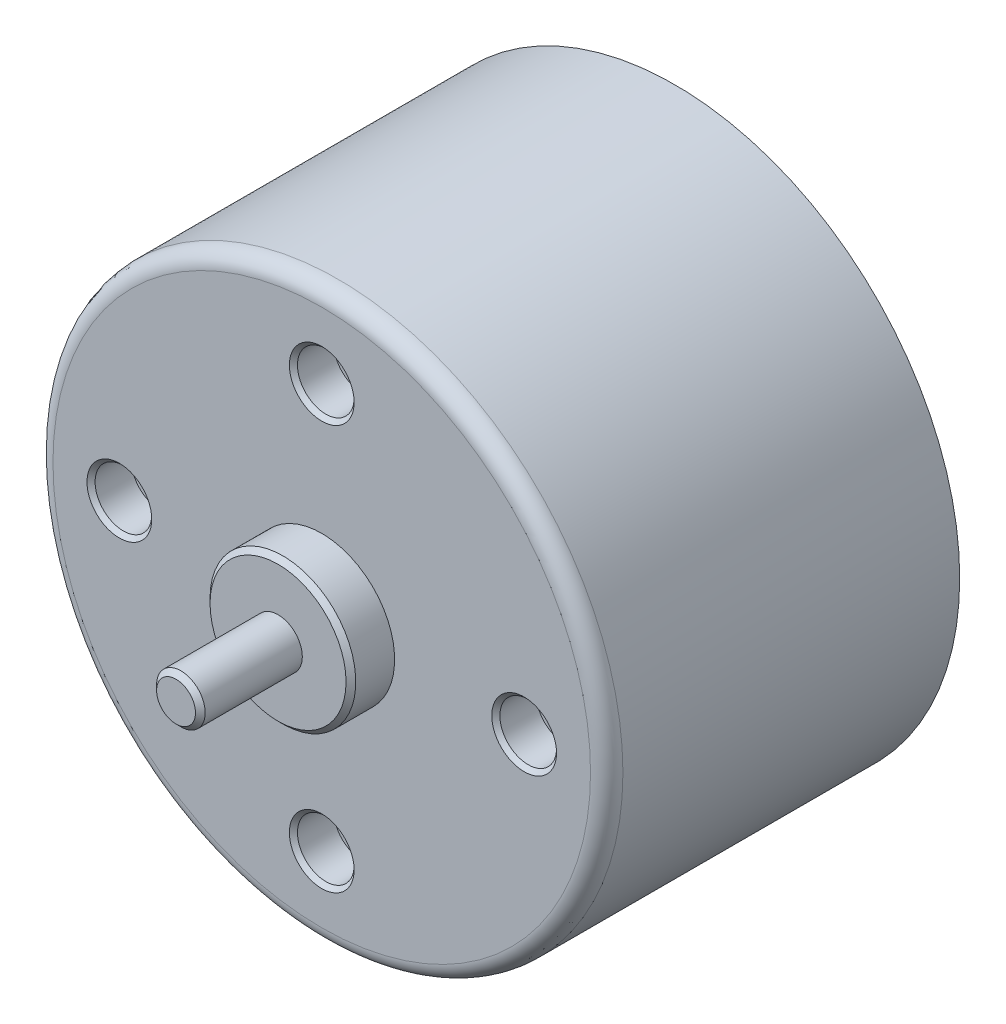
ISO-10303-21;
HEADER;
FILE_DESCRIPTION(('STEP AP214'),'2;1');
FILE_NAME('part.step','',(''),(''),'','','');
FILE_SCHEMA(('AUTOMOTIVE_DESIGN { 1 0 10303 214 1 1 1 1 }'));
ENDSEC;
DATA;
#1=APPLICATION_CONTEXT('core data for automotive mechanical design processes');
#2=APPLICATION_PROTOCOL_DEFINITION('international standard','automotive_design',2000,#1);
#3=PRODUCT_CONTEXT('',#1,'mechanical');
#4=PRODUCT('Part','Part','',(#3));
#5=PRODUCT_RELATED_PRODUCT_CATEGORY('part','',(#4));
#6=PRODUCT_DEFINITION_FORMATION('','',#4);
#7=PRODUCT_DEFINITION_CONTEXT('part definition',#1,'design');
#8=PRODUCT_DEFINITION('design','',#6,#7);
#9=PRODUCT_DEFINITION_SHAPE('','',#8);
#10=(LENGTH_UNIT() NAMED_UNIT(*) SI_UNIT(.MILLI.,.METRE.));
#11=(NAMED_UNIT(*) PLANE_ANGLE_UNIT() SI_UNIT($,.RADIAN.));
#12=(NAMED_UNIT(*) SI_UNIT($,.STERADIAN.) SOLID_ANGLE_UNIT());
#13=UNCERTAINTY_MEASURE_WITH_UNIT(LENGTH_MEASURE(1.E-05),#10,'distance_accuracy_value','');
#14=(GEOMETRIC_REPRESENTATION_CONTEXT(3) GLOBAL_UNCERTAINTY_ASSIGNED_CONTEXT((#13)) GLOBAL_UNIT_ASSIGNED_CONTEXT((#10,
#11,#12)) REPRESENTATION_CONTEXT('',''));
#15=CARTESIAN_POINT('',(0.,0.,0.));
#16=DIRECTION('',(0.,0.,1.));
#17=DIRECTION('',(1.,0.,0.));
#18=AXIS2_PLACEMENT_3D('',#15,#16,#17);
#19=CARTESIAN_POINT('',(0.,0.,21.8));
#20=DIRECTION('',(0.,0.,-1.));
#21=DIRECTION('',(-1.,0.,0.));
#22=AXIS2_PLACEMENT_3D('',#19,#20,#21);
#23=CYLINDRICAL_SURFACE('',#22,17.6);
#24=CARTESIAN_POINT('',(0.,0.,20.8));
#25=DIRECTION('',(0.,0.,1.));
#26=DIRECTION('',(1.,0.,0.));
#27=AXIS2_PLACEMENT_3D('',#24,#25,#26);
#28=CIRCLE('',#27,17.6);
#29=CARTESIAN_POINT('',(17.6,0.,20.8));
#30=VERTEX_POINT('',#29);
#31=EDGE_CURVE('E51',#30,#30,#28,.F.);
#32=ORIENTED_EDGE('',*,*,#31,.T.);
#33=EDGE_LOOP('',(#32));
#34=FACE_BOUND('',#33,.T.);
#35=CARTESIAN_POINT('',(0.,0.,0.));
#36=DIRECTION('',(0.,0.,1.));
#37=DIRECTION('',(1.,0.,0.));
#38=AXIS2_PLACEMENT_3D('',#35,#36,#37);
#39=CIRCLE('',#38,17.6);
#40=CARTESIAN_POINT('',(17.6,0.,0.));
#41=VERTEX_POINT('',#40);
#42=EDGE_CURVE('E94',#41,#41,#39,.T.);
#43=ORIENTED_EDGE('',*,*,#42,.T.);
#44=EDGE_LOOP('',(#43));
#45=FACE_BOUND('',#44,.T.);
#46=ADVANCED_FACE('F31',(#34,#45),#23,.T.);
#47=CARTESIAN_POINT('',(0.,0.,21.8));
#48=DIRECTION('',(0.,0.,1.));
#49=DIRECTION('',(1.,0.,0.));
#50=AXIS2_PLACEMENT_3D('',#47,#48,#49);
#51=PLANE('',#50);
#52=CARTESIAN_POINT('',(0.,0.,21.8));
#53=DIRECTION('',(0.,0.,1.));
#54=DIRECTION('',(1.,0.,0.));
#55=AXIS2_PLACEMENT_3D('',#52,#53,#54);
#56=CIRCLE('',#55,16.6);
#57=CARTESIAN_POINT('',(16.6,0.,21.8));
#58=VERTEX_POINT('',#57);
#59=EDGE_CURVE('E54',#58,#58,#56,.T.);
#60=ORIENTED_EDGE('',*,*,#59,.T.);
#61=EDGE_LOOP('',(#60));
#62=FACE_BOUND('',#61,.T.);
#63=CARTESIAN_POINT('',(0.,-12.5,21.8));
#64=DIRECTION('',(0.,0.,1.));
#65=DIRECTION('',(1.,0.,0.));
#66=AXIS2_PLACEMENT_3D('',#63,#64,#65);
#67=CIRCLE('',#66,2.00000000000002);
#68=CARTESIAN_POINT('',(2.00000000000002,-12.5,21.8));
#69=VERTEX_POINT('',#68);
#70=EDGE_CURVE('E78',#69,#69,#67,.F.);
#71=ORIENTED_EDGE('',*,*,#70,.T.);
#72=EDGE_LOOP('',(#71));
#73=FACE_BOUND('',#72,.T.);
#74=CARTESIAN_POINT('',(12.5,0.,21.8));
#75=DIRECTION('',(0.,0.,1.));
#76=DIRECTION('',(1.,0.,0.));
#77=AXIS2_PLACEMENT_3D('',#74,#75,#76);
#78=CIRCLE('',#77,1.99999999999999);
#79=CARTESIAN_POINT('',(14.5,0.,21.8));
#80=VERTEX_POINT('',#79);
#81=EDGE_CURVE('E81',#80,#80,#78,.F.);
#82=ORIENTED_EDGE('',*,*,#81,.T.);
#83=EDGE_LOOP('',(#82));
#84=FACE_BOUND('',#83,.T.);
#85=CARTESIAN_POINT('',(-12.5,0.,21.8));
#86=DIRECTION('',(0.,0.,1.));
#87=DIRECTION('',(1.,0.,0.));
#88=AXIS2_PLACEMENT_3D('',#85,#86,#87);
#89=CIRCLE('',#88,1.99999999999999);
#90=CARTESIAN_POINT('',(-10.5,0.,21.8));
#91=VERTEX_POINT('',#90);
#92=EDGE_CURVE('E84',#91,#91,#89,.F.);
#93=ORIENTED_EDGE('',*,*,#92,.T.);
#94=EDGE_LOOP('',(#93));
#95=FACE_BOUND('',#94,.T.);
#96=CARTESIAN_POINT('',(0.,12.5,21.8));
#97=DIRECTION('',(0.,0.,1.));
#98=DIRECTION('',(1.,0.,0.));
#99=AXIS2_PLACEMENT_3D('',#96,#97,#98);
#100=CIRCLE('',#99,2.00000000000002);
#101=CARTESIAN_POINT('',(2.00000000000002,12.5,21.8));
#102=VERTEX_POINT('',#101);
#103=EDGE_CURVE('E87',#102,#102,#100,.F.);
#104=ORIENTED_EDGE('',*,*,#103,.T.);
#105=EDGE_LOOP('',(#104));
#106=FACE_BOUND('',#105,.T.);
#107=CARTESIAN_POINT('',(0.,0.,21.8));
#108=DIRECTION('',(0.,0.,1.));
#109=DIRECTION('',(1.,0.,0.));
#110=AXIS2_PLACEMENT_3D('',#107,#108,#109);
#111=CIRCLE('',#110,4.5);
#112=CARTESIAN_POINT('',(-4.5,0.,21.8));
#113=VERTEX_POINT('',#112);
#114=EDGE_CURVE('E97',#113,#113,#111,.T.);
#115=ORIENTED_EDGE('',*,*,#114,.F.);
#116=EDGE_LOOP('',(#115));
#117=FACE_BOUND('',#116,.T.);
#118=ADVANCED_FACE('F138',(#62,#73,#84,#95,#106,#117),#51,.T.);
#119=CARTESIAN_POINT('',(0.,0.,0.));
#120=DIRECTION('',(0.,0.,1.));
#121=DIRECTION('',(1.,0.,0.));
#122=AXIS2_PLACEMENT_3D('',#119,#120,#121);
#123=PLANE('',#122);
#124=CARTESIAN_POINT('',(0.,0.,0.));
#125=DIRECTION('',(0.,0.,-1.));
#126=DIRECTION('',(-1.,0.,0.));
#127=AXIS2_PLACEMENT_3D('',#124,#125,#126);
#128=CIRCLE('',#127,4.5);
#129=CARTESIAN_POINT('',(4.5,0.,0.));
#130=VERTEX_POINT('',#129);
#131=EDGE_CURVE('E104',#130,#130,#128,.T.);
#132=ORIENTED_EDGE('',*,*,#131,.F.);
#133=EDGE_LOOP('',(#132));
#134=FACE_BOUND('',#133,.T.);
#135=ORIENTED_EDGE('',*,*,#42,.F.);
#136=EDGE_LOOP('',(#135));
#137=FACE_BOUND('',#136,.T.);
#138=ADVANCED_FACE('F144',(#134,#137),#123,.F.);
#139=CARTESIAN_POINT('',(0.,0.,24.5));
#140=DIRECTION('',(0.,0.,-1.));
#141=DIRECTION('',(-1.,0.,0.));
#142=AXIS2_PLACEMENT_3D('',#139,#140,#141);
#143=CYLINDRICAL_SURFACE('',#142,4.5);
#144=CARTESIAN_POINT('',(0.,0.,24.2));
#145=DIRECTION('',(0.,0.,1.));
#146=DIRECTION('',(1.,0.,0.));
#147=AXIS2_PLACEMENT_3D('',#144,#145,#146);
#148=CIRCLE('',#147,4.5);
#149=CARTESIAN_POINT('',(-4.5,0.,24.2));
#150=VERTEX_POINT('',#149);
#151=EDGE_CURVE('E57',#150,#150,#148,.F.);
#152=CARTESIAN_POINT('',(-4.5,0.,24.2));
#153=CARTESIAN_POINT('',(-4.5,0.,24.175));
#154=CARTESIAN_POINT('',(-4.5,0.,24.15));
#155=CARTESIAN_POINT('',(-4.5,0.,24.1));
#156=CARTESIAN_POINT('',(-4.5,0.,24.075));
#157=CARTESIAN_POINT('',(-4.5,0.,24.025));
#158=CARTESIAN_POINT('',(-4.5,0.,24.));
#159=CARTESIAN_POINT('',(-4.5,0.,23.95));
#160=CARTESIAN_POINT('',(-4.5,0.,23.925));
#161=CARTESIAN_POINT('',(-4.5,0.,23.875));
#162=CARTESIAN_POINT('',(-4.5,0.,23.85));
#163=CARTESIAN_POINT('',(-4.5,0.,23.8));
#164=CARTESIAN_POINT('',(-4.5,0.,23.775));
#165=CARTESIAN_POINT('',(-4.5,0.,23.725));
#166=CARTESIAN_POINT('',(-4.5,0.,23.7));
#167=CARTESIAN_POINT('',(-4.5,0.,23.65));
#168=CARTESIAN_POINT('',(-4.5,0.,23.625));
#169=CARTESIAN_POINT('',(-4.5,0.,23.575));
#170=CARTESIAN_POINT('',(-4.5,0.,23.55));
#171=CARTESIAN_POINT('',(-4.5,0.,23.5));
#172=CARTESIAN_POINT('',(-4.5,0.,23.475));
#173=CARTESIAN_POINT('',(-4.5,0.,23.425));
#174=CARTESIAN_POINT('',(-4.5,0.,23.4));
#175=CARTESIAN_POINT('',(-4.5,0.,23.35));
#176=CARTESIAN_POINT('',(-4.5,0.,23.325));
#177=CARTESIAN_POINT('',(-4.5,0.,23.275));
#178=CARTESIAN_POINT('',(-4.5,0.,23.25));
#179=CARTESIAN_POINT('',(-4.5,0.,23.2));
#180=CARTESIAN_POINT('',(-4.5,0.,23.175));
#181=CARTESIAN_POINT('',(-4.5,0.,23.125));
#182=CARTESIAN_POINT('',(-4.5,0.,23.1));
#183=CARTESIAN_POINT('',(-4.5,0.,23.05));
#184=CARTESIAN_POINT('',(-4.5,0.,23.025));
#185=CARTESIAN_POINT('',(-4.5,0.,22.975));
#186=CARTESIAN_POINT('',(-4.5,0.,22.95));
#187=CARTESIAN_POINT('',(-4.5,0.,22.9));
#188=CARTESIAN_POINT('',(-4.5,0.,22.875));
#189=CARTESIAN_POINT('',(-4.5,0.,22.825));
#190=CARTESIAN_POINT('',(-4.5,0.,22.8));
#191=CARTESIAN_POINT('',(-4.5,0.,22.75));
#192=CARTESIAN_POINT('',(-4.5,0.,22.725));
#193=CARTESIAN_POINT('',(-4.5,0.,22.675));
#194=CARTESIAN_POINT('',(-4.5,0.,22.65));
#195=CARTESIAN_POINT('',(-4.5,0.,22.6));
#196=CARTESIAN_POINT('',(-4.5,0.,22.575));
#197=CARTESIAN_POINT('',(-4.5,0.,22.525));
#198=CARTESIAN_POINT('',(-4.5,0.,22.5));
#199=CARTESIAN_POINT('',(-4.5,0.,22.45));
#200=CARTESIAN_POINT('',(-4.5,0.,22.425));
#201=CARTESIAN_POINT('',(-4.5,0.,22.375));
#202=CARTESIAN_POINT('',(-4.5,0.,22.35));
#203=CARTESIAN_POINT('',(-4.5,0.,22.3));
#204=CARTESIAN_POINT('',(-4.5,0.,22.275));
#205=CARTESIAN_POINT('',(-4.5,0.,22.225));
#206=CARTESIAN_POINT('',(-4.5,0.,22.2));
#207=CARTESIAN_POINT('',(-4.5,0.,22.15));
#208=CARTESIAN_POINT('',(-4.5,0.,22.125));
#209=CARTESIAN_POINT('',(-4.5,0.,22.075));
#210=CARTESIAN_POINT('',(-4.5,0.,22.05));
#211=CARTESIAN_POINT('',(-4.5,0.,22.));
#212=CARTESIAN_POINT('',(-4.5,0.,21.975));
#213=CARTESIAN_POINT('',(-4.5,0.,21.925));
#214=CARTESIAN_POINT('',(-4.5,0.,21.9));
#215=CARTESIAN_POINT('',(-4.5,0.,21.85));
#216=CARTESIAN_POINT('',(-4.5,0.,21.825));
#217=CARTESIAN_POINT('',(-4.5,0.,21.8));
#218=B_SPLINE_CURVE_WITH_KNOTS('',3,(#152,#153,#154,#155,#156,#157,#158,#159,#160,#161,#162,
#163,#164,#165,#166,#167,#168,#169,#170,#171,#172,#173,#174,#175,#176,#177,#178,#179,#180,#181,
#182,#183,#184,#185,#186,#187,#188,#189,#190,#191,#192,#193,#194,#195,#196,#197,#198,#199,#200,
#201,#202,#203,#204,#205,#206,#207,#208,#209,#210,#211,#212,#213,#214,#215,#216,#217),
.UNSPECIFIED.,.F.,.F.,(4,2,2,2,2,2,2,2,2,2,2,2,2,2,2,2,2,2,2,2,2,2,2,2,2,2,2,2,2,2,2,2,4),(0.,
0.0749999999999987,0.150000000000001,0.225,0.300000000000002,0.375,0.450000000000003,
0.525000000000001,0.600000000000003,0.675000000000002,0.750000000000004,0.825000000000003,
0.900000000000005,0.975000000000004,1.05000000000001,1.125,1.20000000000001,1.27500000000001,
1.35000000000001,1.42500000000001,1.50000000000001,1.57500000000001,1.65000000000001,
1.72500000000001,1.80000000000001,1.87500000000001,1.95000000000001,2.02500000000001,
2.10000000000001,2.17500000000001,2.25000000000001,2.32500000000001,2.40000000000001),.UNSPECIFIED.);
#219=EDGE_CURVE('BSEAM206',#150,#113,#218,.T.);
#220=ORIENTED_EDGE('',*,*,#151,.T.);
#221=ORIENTED_EDGE('',*,*,#114,.T.);
#222=ORIENTED_EDGE('',*,*,#219,.T.);
#223=ORIENTED_EDGE('',*,*,#219,.F.);
#224=EDGE_LOOP('',(#220,#222,#221,#223));
#225=FACE_BOUND('',#224,.T.);
#226=ADVANCED_FACE('F206',(#225),#143,.T.);
#227=CARTESIAN_POINT('',(0.,0.,24.5));
#228=DIRECTION('',(0.,0.,1.));
#229=DIRECTION('',(1.,0.,0.));
#230=AXIS2_PLACEMENT_3D('',#227,#228,#229);
#231=PLANE('',#230);
#232=CARTESIAN_POINT('',(0.,0.,24.5));
#233=DIRECTION('',(0.,0.,1.));
#234=DIRECTION('',(1.,0.,0.));
#235=AXIS2_PLACEMENT_3D('',#232,#233,#234);
#236=CIRCLE('',#235,4.20000000000002);
#237=CARTESIAN_POINT('',(4.20000000000002,0.,24.5));
#238=VERTEX_POINT('',#237);
#239=EDGE_CURVE('E60',#238,#238,#236,.T.);
#240=ORIENTED_EDGE('',*,*,#239,.T.);
#241=EDGE_LOOP('',(#240));
#242=FACE_BOUND('',#241,.T.);
#243=CARTESIAN_POINT('',(0.,0.,24.5));
#244=DIRECTION('',(0.,0.,1.));
#245=DIRECTION('',(1.,0.,0.));
#246=AXIS2_PLACEMENT_3D('',#243,#244,#245);
#247=CIRCLE('',#246,1.5);
#248=CARTESIAN_POINT('',(1.5,0.,24.5));
#249=VERTEX_POINT('',#248);
#250=EDGE_CURVE('E101',#249,#249,#247,.T.);
#251=ORIENTED_EDGE('',*,*,#250,.F.);
#252=EDGE_LOOP('',(#251));
#253=FACE_BOUND('',#252,.T.);
#254=ADVANCED_FACE('F199',(#242,#253),#231,.T.);
#255=CARTESIAN_POINT('',(0.,0.,30.8));
#256=DIRECTION('',(0.,0.,-1.));
#257=DIRECTION('',(-1.,0.,0.));
#258=AXIS2_PLACEMENT_3D('',#255,#256,#257);
#259=CYLINDRICAL_SURFACE('',#258,1.5);
#260=CARTESIAN_POINT('',(0.,0.,30.5));
#261=DIRECTION('',(0.,0.,1.));
#262=DIRECTION('',(1.,0.,0.));
#263=AXIS2_PLACEMENT_3D('',#260,#261,#262);
#264=CIRCLE('',#263,1.5);
#265=CARTESIAN_POINT('',(1.5,0.,30.5));
#266=VERTEX_POINT('',#265);
#267=EDGE_CURVE('E42',#266,#266,#264,.F.);
#268=ORIENTED_EDGE('',*,*,#267,.T.);
#269=EDGE_LOOP('',(#268));
#270=FACE_BOUND('',#269,.T.);
#271=ORIENTED_EDGE('',*,*,#250,.T.);
#272=EDGE_LOOP('',(#271));
#273=FACE_BOUND('',#272,.T.);
#274=ADVANCED_FACE('F190',(#270,#273),#259,.T.);
#275=CARTESIAN_POINT('',(0.,0.,30.8));
#276=DIRECTION('',(0.,0.,1.));
#277=DIRECTION('',(1.,0.,0.));
#278=AXIS2_PLACEMENT_3D('',#275,#276,#277);
#279=PLANE('',#278);
#280=CARTESIAN_POINT('',(0.,0.,30.8));
#281=DIRECTION('',(0.,0.,1.));
#282=DIRECTION('',(1.,0.,0.));
#283=AXIS2_PLACEMENT_3D('',#280,#281,#282);
#284=CIRCLE('',#283,1.20000000000001);
#285=CARTESIAN_POINT('',(1.20000000000001,0.,30.8));
#286=VERTEX_POINT('',#285);
#287=EDGE_CURVE('E46',#286,#286,#284,.T.);
#288=ORIENTED_EDGE('',*,*,#287,.T.);
#289=EDGE_LOOP('',(#288));
#290=FACE_BOUND('',#289,.T.);
#291=ADVANCED_FACE('F187',(#290),#279,.T.);
#292=CARTESIAN_POINT('',(0.,0.,-2.7));
#293=DIRECTION('',(0.,0.,1.));
#294=DIRECTION('',(1.,0.,0.));
#295=AXIS2_PLACEMENT_3D('',#292,#293,#294);
#296=CYLINDRICAL_SURFACE('',#295,4.5);
#297=CARTESIAN_POINT('',(0.,0.,-2.40000000000001));
#298=DIRECTION('',(0.,0.,-1.));
#299=DIRECTION('',(-1.,0.,0.));
#300=AXIS2_PLACEMENT_3D('',#297,#298,#299);
#301=CIRCLE('',#300,4.5);
#302=CARTESIAN_POINT('',(4.5,0.,-2.40000000000001));
#303=VERTEX_POINT('',#302);
#304=EDGE_CURVE('E63',#303,#303,#301,.F.);
#305=CARTESIAN_POINT('',(4.5,0.,-2.40000000000001));
#306=CARTESIAN_POINT('',(4.5,0.,-2.37500000000001));
#307=CARTESIAN_POINT('',(4.5,0.,-2.35000000000001));
#308=CARTESIAN_POINT('',(4.5,0.,-2.30000000000001));
#309=CARTESIAN_POINT('',(4.5,0.,-2.27500000000001));
#310=CARTESIAN_POINT('',(4.5,0.,-2.22500000000001));
#311=CARTESIAN_POINT('',(4.5,0.,-2.20000000000001));
#312=CARTESIAN_POINT('',(4.5,0.,-2.15000000000001));
#313=CARTESIAN_POINT('',(4.5,0.,-2.12500000000001));
#314=CARTESIAN_POINT('',(4.5,0.,-2.07500000000001));
#315=CARTESIAN_POINT('',(4.5,0.,-2.05000000000001));
#316=CARTESIAN_POINT('',(4.5,0.,-2.00000000000001));
#317=CARTESIAN_POINT('',(4.5,0.,-1.97500000000001));
#318=CARTESIAN_POINT('',(4.5,0.,-1.92500000000001));
#319=CARTESIAN_POINT('',(4.5,0.,-1.90000000000001));
#320=CARTESIAN_POINT('',(4.5,0.,-1.85000000000001));
#321=CARTESIAN_POINT('',(4.5,0.,-1.82500000000001));
#322=CARTESIAN_POINT('',(4.5,0.,-1.77500000000001));
#323=CARTESIAN_POINT('',(4.5,0.,-1.75000000000001));
#324=CARTESIAN_POINT('',(4.5,0.,-1.70000000000001));
#325=CARTESIAN_POINT('',(4.5,0.,-1.67500000000001));
#326=CARTESIAN_POINT('',(4.5,0.,-1.62500000000001));
#327=CARTESIAN_POINT('',(4.5,0.,-1.60000000000001));
#328=CARTESIAN_POINT('',(4.5,0.,-1.55000000000001));
#329=CARTESIAN_POINT('',(4.5,0.,-1.52500000000001));
#330=CARTESIAN_POINT('',(4.5,0.,-1.47500000000001));
#331=CARTESIAN_POINT('',(4.5,0.,-1.45000000000001));
#332=CARTESIAN_POINT('',(4.5,0.,-1.40000000000001));
#333=CARTESIAN_POINT('',(4.5,0.,-1.37500000000001));
#334=CARTESIAN_POINT('',(4.5,0.,-1.32500000000001));
#335=CARTESIAN_POINT('',(4.5,0.,-1.30000000000001));
#336=CARTESIAN_POINT('',(4.5,0.,-1.25000000000001));
#337=CARTESIAN_POINT('',(4.5,0.,-1.22500000000001));
#338=CARTESIAN_POINT('',(4.5,0.,-1.17500000000001));
#339=CARTESIAN_POINT('',(4.5,0.,-1.15000000000001));
#340=CARTESIAN_POINT('',(4.5,0.,-1.10000000000001));
#341=CARTESIAN_POINT('',(4.5,0.,-1.07500000000001));
#342=CARTESIAN_POINT('',(4.5,0.,-1.02500000000001));
#343=CARTESIAN_POINT('',(4.5,0.,-1.00000000000001));
#344=CARTESIAN_POINT('',(4.5,0.,-0.950000000000005));
#345=CARTESIAN_POINT('',(4.5,0.,-0.925000000000005));
#346=CARTESIAN_POINT('',(4.5,0.,-0.875000000000005));
#347=CARTESIAN_POINT('',(4.5,0.,-0.850000000000005));
#348=CARTESIAN_POINT('',(4.5,0.,-0.800000000000004));
#349=CARTESIAN_POINT('',(4.5,0.,-0.775000000000004));
#350=CARTESIAN_POINT('',(4.5,0.,-0.725000000000004));
#351=CARTESIAN_POINT('',(4.5,0.,-0.700000000000004));
#352=CARTESIAN_POINT('',(4.5,0.,-0.650000000000003));
#353=CARTESIAN_POINT('',(4.5,0.,-0.625000000000003));
#354=CARTESIAN_POINT('',(4.5,0.,-0.575000000000003));
#355=CARTESIAN_POINT('',(4.5,0.,-0.550000000000003));
#356=CARTESIAN_POINT('',(4.5,0.,-0.500000000000002));
#357=CARTESIAN_POINT('',(4.5,0.,-0.475000000000002));
#358=CARTESIAN_POINT('',(4.5,0.,-0.425000000000002));
#359=CARTESIAN_POINT('',(4.5,0.,-0.400000000000002));
#360=CARTESIAN_POINT('',(4.5,0.,-0.350000000000002));
#361=CARTESIAN_POINT('',(4.5,0.,-0.325000000000001));
#362=CARTESIAN_POINT('',(4.5,0.,-0.275000000000001));
#363=CARTESIAN_POINT('',(4.5,0.,-0.250000000000001));
#364=CARTESIAN_POINT('',(4.5,0.,-0.200000000000001));
#365=CARTESIAN_POINT('',(4.5,0.,-0.175000000000001));
#366=CARTESIAN_POINT('',(4.5,0.,-0.125));
#367=CARTESIAN_POINT('',(4.5,0.,-0.1));
#368=CARTESIAN_POINT('',(4.5,0.,-0.0499999999999999));
#369=CARTESIAN_POINT('',(4.5,0.,-0.0249999999999997));
#370=CARTESIAN_POINT('',(4.5,0.,0.));
#371=B_SPLINE_CURVE_WITH_KNOTS('',3,(#305,#306,#307,#308,#309,#310,#311,#312,#313,#314,#315,
#316,#317,#318,#319,#320,#321,#322,#323,#324,#325,#326,#327,#328,#329,#330,#331,#332,#333,#334,
#335,#336,#337,#338,#339,#340,#341,#342,#343,#344,#345,#346,#347,#348,#349,#350,#351,#352,#353,
#354,#355,#356,#357,#358,#359,#360,#361,#362,#363,#364,#365,#366,#367,#368,#369,#370),
.UNSPECIFIED.,.F.,.F.,(4,2,2,2,2,2,2,2,2,2,2,2,2,2,2,2,2,2,2,2,2,2,2,2,2,2,2,2,2,2,2,2,4),(0.,
0.0750000000000004,0.150000000000001,0.225000000000001,0.300000000000002,0.375000000000002,
0.450000000000003,0.525000000000003,0.600000000000003,0.675000000000004,0.750000000000004,
0.825000000000004,0.900000000000005,0.975000000000005,1.05000000000001,1.12500000000001,
1.20000000000001,1.27500000000001,1.35000000000001,1.42500000000001,1.50000000000001,
1.57500000000001,1.65000000000001,1.72500000000001,1.80000000000001,1.87500000000001,
1.95000000000001,2.02500000000001,2.10000000000001,2.17500000000001,2.25000000000001,
2.32500000000001,2.40000000000001),.UNSPECIFIED.);
#372=EDGE_CURVE('BSEAM189',#303,#130,#371,.T.);
#373=ORIENTED_EDGE('',*,*,#304,.T.);
#374=ORIENTED_EDGE('',*,*,#131,.T.);
#375=ORIENTED_EDGE('',*,*,#372,.T.);
#376=ORIENTED_EDGE('',*,*,#372,.F.);
#377=EDGE_LOOP('',(#373,#375,#374,#376));
#378=FACE_BOUND('',#377,.T.);
#379=ADVANCED_FACE('F189',(#378),#296,.T.);
#380=CARTESIAN_POINT('',(0.,0.,-2.7));
#381=DIRECTION('',(0.,0.,-1.));
#382=DIRECTION('',(-1.,0.,0.));
#383=AXIS2_PLACEMENT_3D('',#380,#381,#382);
#384=PLANE('',#383);
#385=CARTESIAN_POINT('',(0.,0.,-2.7));
#386=DIRECTION('',(0.,0.,-1.));
#387=DIRECTION('',(-1.,0.,0.));
#388=AXIS2_PLACEMENT_3D('',#385,#386,#387);
#389=CIRCLE('',#388,4.20000000000002);
#390=CARTESIAN_POINT('',(-4.20000000000002,0.,-2.7));
#391=VERTEX_POINT('',#390);
#392=EDGE_CURVE('E66',#391,#391,#389,.T.);
#393=ORIENTED_EDGE('',*,*,#392,.T.);
#394=EDGE_LOOP('',(#393));
#395=FACE_BOUND('',#394,.T.);
#396=CARTESIAN_POINT('',(0.,0.,-2.7));
#397=DIRECTION('',(0.,0.,-1.));
#398=DIRECTION('',(-1.,0.,0.));
#399=AXIS2_PLACEMENT_3D('',#396,#397,#398);
#400=CIRCLE('',#399,1.5);
#401=CARTESIAN_POINT('',(-1.5,0.,-2.7));
#402=VERTEX_POINT('',#401);
#403=EDGE_CURVE('E93',#402,#402,#400,.T.);
#404=ORIENTED_EDGE('',*,*,#403,.F.);
#405=EDGE_LOOP('',(#404));
#406=FACE_BOUND('',#405,.T.);
#407=ADVANCED_FACE('F196',(#395,#406),#384,.T.);
#408=CARTESIAN_POINT('',(0.,0.,-5.2));
#409=DIRECTION('',(0.,0.,1.));
#410=DIRECTION('',(1.,0.,0.));
#411=AXIS2_PLACEMENT_3D('',#408,#409,#410);
#412=CYLINDRICAL_SURFACE('',#411,1.5);
#413=CARTESIAN_POINT('',(0.,0.,-4.90000000000002));
#414=DIRECTION('',(0.,0.,-1.));
#415=DIRECTION('',(-1.,0.,0.));
#416=AXIS2_PLACEMENT_3D('',#413,#414,#415);
#417=CIRCLE('',#416,1.5);
#418=CARTESIAN_POINT('',(-1.5,0.,-4.90000000000002));
#419=VERTEX_POINT('',#418);
#420=EDGE_CURVE('E10',#419,#419,#417,.F.);
#421=ORIENTED_EDGE('',*,*,#420,.T.);
#422=EDGE_LOOP('',(#421));
#423=FACE_BOUND('',#422,.T.);
#424=ORIENTED_EDGE('',*,*,#403,.T.);
#425=EDGE_LOOP('',(#424));
#426=FACE_BOUND('',#425,.T.);
#427=ADVANCED_FACE('F262',(#423,#426),#412,.T.);
#428=CARTESIAN_POINT('',(0.,0.,-5.2));
#429=DIRECTION('',(0.,0.,-1.));
#430=DIRECTION('',(-1.,0.,0.));
#431=AXIS2_PLACEMENT_3D('',#428,#429,#430);
#432=PLANE('',#431);
#433=CARTESIAN_POINT('',(0.,0.,-5.2));
#434=DIRECTION('',(0.,0.,-1.));
#435=DIRECTION('',(-1.,0.,0.));
#436=AXIS2_PLACEMENT_3D('',#433,#434,#435);
#437=CIRCLE('',#436,1.20000000000001);
#438=CARTESIAN_POINT('',(-1.20000000000001,0.,-5.2));
#439=VERTEX_POINT('',#438);
#440=EDGE_CURVE('E38',#439,#439,#437,.T.);
#441=ORIENTED_EDGE('',*,*,#440,.T.);
#442=EDGE_LOOP('',(#441));
#443=FACE_BOUND('',#442,.T.);
#444=ADVANCED_FACE('F267',(#443),#432,.T.);
#445=CARTESIAN_POINT('',(-12.5,0.,19.3));
#446=DIRECTION('',(0.,0.,1.));
#447=DIRECTION('',(1.,0.,0.));
#448=AXIS2_PLACEMENT_3D('',#445,#446,#447);
#449=CYLINDRICAL_SURFACE('',#448,1.75);
#450=CARTESIAN_POINT('',(-12.5,0.,21.55));
#451=DIRECTION('',(0.,0.,1.));
#452=DIRECTION('',(1.,0.,0.));
#453=AXIS2_PLACEMENT_3D('',#450,#451,#452);
#454=CIRCLE('',#453,1.75);
#455=CARTESIAN_POINT('',(-10.75,0.,21.55));
#456=VERTEX_POINT('',#455);
#457=EDGE_CURVE('E72',#456,#456,#454,.T.);
#458=ORIENTED_EDGE('',*,*,#457,.T.);
#459=EDGE_LOOP('',(#458));
#460=FACE_BOUND('',#459,.T.);
#461=CARTESIAN_POINT('',(-12.5,0.,19.3));
#462=DIRECTION('',(0.,0.,1.));
#463=DIRECTION('',(1.,0.,0.));
#464=AXIS2_PLACEMENT_3D('',#461,#462,#463);
#465=CIRCLE('',#464,1.75);
#466=CARTESIAN_POINT('',(-10.75,0.,19.3));
#467=VERTEX_POINT('',#466);
#468=EDGE_CURVE('E109',#467,#467,#465,.T.);
#469=ORIENTED_EDGE('',*,*,#468,.F.);
#470=EDGE_LOOP('',(#469));
#471=FACE_BOUND('',#470,.T.);
#472=ADVANCED_FACE('F277',(#460,#471),#449,.F.);
#473=CARTESIAN_POINT('',(-12.5,0.,19.3));
#474=DIRECTION('',(0.,0.,1.));
#475=DIRECTION('',(1.,0.,0.));
#476=AXIS2_PLACEMENT_3D('',#473,#474,#475);
#477=PLANE('',#476);
#478=ORIENTED_EDGE('',*,*,#468,.T.);
#479=EDGE_LOOP('',(#478));
#480=FACE_BOUND('',#479,.T.);
#481=ADVANCED_FACE('F296',(#480),#477,.T.);
#482=CARTESIAN_POINT('',(0.,-12.5,19.3));
#483=DIRECTION('',(0.,0.,1.));
#484=DIRECTION('',(1.,0.,0.));
#485=AXIS2_PLACEMENT_3D('',#482,#483,#484);
#486=CYLINDRICAL_SURFACE('',#485,1.75);
#487=CARTESIAN_POINT('',(0.,-12.5,21.55));
#488=DIRECTION('',(0.,0.,1.));
#489=DIRECTION('',(1.,0.,0.));
#490=AXIS2_PLACEMENT_3D('',#487,#488,#489);
#491=CIRCLE('',#490,1.75);
#492=CARTESIAN_POINT('',(1.75,-12.5,21.55));
#493=VERTEX_POINT('',#492);
#494=EDGE_CURVE('E90',#493,#493,#491,.T.);
#495=ORIENTED_EDGE('',*,*,#494,.T.);
#496=EDGE_LOOP('',(#495));
#497=FACE_BOUND('',#496,.T.);
#498=CARTESIAN_POINT('',(0.,-12.5,19.3));
#499=DIRECTION('',(0.,0.,1.));
#500=DIRECTION('',(1.,0.,0.));
#501=AXIS2_PLACEMENT_3D('',#498,#499,#500);
#502=CIRCLE('',#501,1.75);
#503=CARTESIAN_POINT('',(1.75,-12.5,19.3));
#504=VERTEX_POINT('',#503);
#505=EDGE_CURVE('E112',#504,#504,#502,.T.);
#506=ORIENTED_EDGE('',*,*,#505,.F.);
#507=EDGE_LOOP('',(#506));
#508=FACE_BOUND('',#507,.T.);
#509=ADVANCED_FACE('F304',(#497,#508),#486,.F.);
#510=CARTESIAN_POINT('',(0.,-12.5,19.3));
#511=DIRECTION('',(0.,0.,1.));
#512=DIRECTION('',(1.,0.,0.));
#513=AXIS2_PLACEMENT_3D('',#510,#511,#512);
#514=PLANE('',#513);
#515=ORIENTED_EDGE('',*,*,#505,.T.);
#516=EDGE_LOOP('',(#515));
#517=FACE_BOUND('',#516,.T.);
#518=ADVANCED_FACE('F312',(#517),#514,.T.);
#519=CARTESIAN_POINT('',(12.5,0.,19.3));
#520=DIRECTION('',(0.,0.,1.));
#521=DIRECTION('',(1.,0.,0.));
#522=AXIS2_PLACEMENT_3D('',#519,#520,#521);
#523=CYLINDRICAL_SURFACE('',#522,1.75);
#524=CARTESIAN_POINT('',(12.5,0.,21.55));
#525=DIRECTION('',(0.,0.,1.));
#526=DIRECTION('',(1.,0.,0.));
#527=AXIS2_PLACEMENT_3D('',#524,#525,#526);
#528=CIRCLE('',#527,1.75);
#529=CARTESIAN_POINT('',(14.25,0.,21.55));
#530=VERTEX_POINT('',#529);
#531=EDGE_CURVE('E75',#530,#530,#528,.T.);
#532=ORIENTED_EDGE('',*,*,#531,.T.);
#533=EDGE_LOOP('',(#532));
#534=FACE_BOUND('',#533,.T.);
#535=CARTESIAN_POINT('',(12.5,0.,19.3));
#536=DIRECTION('',(0.,0.,1.));
#537=DIRECTION('',(1.,0.,0.));
#538=AXIS2_PLACEMENT_3D('',#535,#536,#537);
#539=CIRCLE('',#538,1.75);
#540=CARTESIAN_POINT('',(14.25,0.,19.3));
#541=VERTEX_POINT('',#540);
#542=EDGE_CURVE('E115',#541,#541,#539,.T.);
#543=ORIENTED_EDGE('',*,*,#542,.F.);
#544=EDGE_LOOP('',(#543));
#545=FACE_BOUND('',#544,.T.);
#546=ADVANCED_FACE('F134',(#534,#545),#523,.F.);
#547=CARTESIAN_POINT('',(12.5,0.,19.3));
#548=DIRECTION('',(0.,0.,1.));
#549=DIRECTION('',(1.,0.,0.));
#550=AXIS2_PLACEMENT_3D('',#547,#548,#549);
#551=PLANE('',#550);
#552=ORIENTED_EDGE('',*,*,#542,.T.);
#553=EDGE_LOOP('',(#552));
#554=FACE_BOUND('',#553,.T.);
#555=ADVANCED_FACE('F125',(#554),#551,.T.);
#556=CARTESIAN_POINT('',(0.,12.5,19.3));
#557=DIRECTION('',(0.,0.,1.));
#558=DIRECTION('',(1.,0.,0.));
#559=AXIS2_PLACEMENT_3D('',#556,#557,#558);
#560=CYLINDRICAL_SURFACE('',#559,1.75);
#561=CARTESIAN_POINT('',(0.,12.5,21.55));
#562=DIRECTION('',(0.,0.,1.));
#563=DIRECTION('',(1.,0.,0.));
#564=AXIS2_PLACEMENT_3D('',#561,#562,#563);
#565=CIRCLE('',#564,1.75);
#566=CARTESIAN_POINT('',(1.75,12.5,21.55));
#567=VERTEX_POINT('',#566);
#568=EDGE_CURVE('E69',#567,#567,#565,.T.);
#569=ORIENTED_EDGE('',*,*,#568,.T.);
#570=EDGE_LOOP('',(#569));
#571=FACE_BOUND('',#570,.T.);
#572=CARTESIAN_POINT('',(0.,12.5,19.3));
#573=DIRECTION('',(0.,0.,1.));
#574=DIRECTION('',(1.,0.,0.));
#575=AXIS2_PLACEMENT_3D('',#572,#573,#574);
#576=CIRCLE('',#575,1.75);
#577=CARTESIAN_POINT('',(1.75,12.5,19.3));
#578=VERTEX_POINT('',#577);
#579=EDGE_CURVE('E98',#578,#578,#576,.T.);
#580=ORIENTED_EDGE('',*,*,#579,.F.);
#581=EDGE_LOOP('',(#580));
#582=FACE_BOUND('',#581,.T.);
#583=ADVANCED_FACE('F123',(#571,#582),#560,.F.);
#584=CARTESIAN_POINT('',(0.,12.5,19.3));
#585=DIRECTION('',(0.,0.,1.));
#586=DIRECTION('',(1.,0.,0.));
#587=AXIS2_PLACEMENT_3D('',#584,#585,#586);
#588=PLANE('',#587);
#589=ORIENTED_EDGE('',*,*,#579,.T.);
#590=EDGE_LOOP('',(#589));
#591=FACE_BOUND('',#590,.T.);
#592=ADVANCED_FACE('F121',(#591),#588,.T.);
#593=CARTESIAN_POINT('',(0.,-12.5,21.55));
#594=DIRECTION('',(0.,0.,1.));
#595=DIRECTION('',(1.,0.,0.));
#596=AXIS2_PLACEMENT_3D('',#593,#594,#595);
#597=CONICAL_SURFACE('',#596,1.75,0.785398163397452);
#598=ORIENTED_EDGE('',*,*,#70,.F.);
#599=EDGE_LOOP('',(#598));
#600=FACE_BOUND('',#599,.T.);
#601=ORIENTED_EDGE('',*,*,#494,.F.);
#602=EDGE_LOOP('',(#601));
#603=FACE_BOUND('',#602,.T.);
#604=ADVANCED_FACE('F132',(#600,#603),#597,.F.);
#605=CARTESIAN_POINT('',(12.5,0.,21.55));
#606=DIRECTION('',(0.,0.,1.));
#607=DIRECTION('',(1.,0.,0.));
#608=AXIS2_PLACEMENT_3D('',#605,#606,#607);
#609=CONICAL_SURFACE('',#608,1.75,0.785398163397445);
#610=ORIENTED_EDGE('',*,*,#81,.F.);
#611=EDGE_LOOP('',(#610));
#612=FACE_BOUND('',#611,.T.);
#613=ORIENTED_EDGE('',*,*,#531,.F.);
#614=EDGE_LOOP('',(#613));
#615=FACE_BOUND('',#614,.T.);
#616=ADVANCED_FACE('F152',(#612,#615),#609,.F.);
#617=CARTESIAN_POINT('',(-12.5,0.,21.55));
#618=DIRECTION('',(0.,0.,1.));
#619=DIRECTION('',(1.,0.,0.));
#620=AXIS2_PLACEMENT_3D('',#617,#618,#619);
#621=CONICAL_SURFACE('',#620,1.75,0.785398163397445);
#622=ORIENTED_EDGE('',*,*,#92,.F.);
#623=EDGE_LOOP('',(#622));
#624=FACE_BOUND('',#623,.T.);
#625=ORIENTED_EDGE('',*,*,#457,.F.);
#626=EDGE_LOOP('',(#625));
#627=FACE_BOUND('',#626,.T.);
#628=ADVANCED_FACE('F156',(#624,#627),#621,.F.);
#629=CARTESIAN_POINT('',(0.,12.5,21.55));
#630=DIRECTION('',(0.,0.,1.));
#631=DIRECTION('',(1.,0.,0.));
#632=AXIS2_PLACEMENT_3D('',#629,#630,#631);
#633=CONICAL_SURFACE('',#632,1.75,0.785398163397452);
#634=ORIENTED_EDGE('',*,*,#103,.F.);
#635=EDGE_LOOP('',(#634));
#636=FACE_BOUND('',#635,.T.);
#637=ORIENTED_EDGE('',*,*,#568,.F.);
#638=EDGE_LOOP('',(#637));
#639=FACE_BOUND('',#638,.T.);
#640=ADVANCED_FACE('F160',(#636,#639),#633,.F.);
#641=CARTESIAN_POINT('',(0.,0.,-2.7));
#642=DIRECTION('',(0.,0.,1.));
#643=DIRECTION('',(1.,0.,0.));
#644=AXIS2_PLACEMENT_3D('',#641,#642,#643);
#645=CONICAL_SURFACE('',#644,4.20000000000002,0.785398163397444);
#646=ORIENTED_EDGE('',*,*,#304,.F.);
#647=EDGE_LOOP('',(#646));
#648=FACE_BOUND('',#647,.T.);
#649=ORIENTED_EDGE('',*,*,#392,.F.);
#650=EDGE_LOOP('',(#649));
#651=FACE_BOUND('',#650,.T.);
#652=ADVANCED_FACE('F164',(#648,#651),#645,.T.);
#653=CARTESIAN_POINT('',(0.,0.,24.5));
#654=DIRECTION('',(0.,0.,-1.));
#655=DIRECTION('',(-1.,0.,0.));
#656=AXIS2_PLACEMENT_3D('',#653,#654,#655);
#657=CONICAL_SURFACE('',#656,4.20000000000002,0.785398163397443);
#658=ORIENTED_EDGE('',*,*,#151,.F.);
#659=EDGE_LOOP('',(#658));
#660=FACE_BOUND('',#659,.T.);
#661=ORIENTED_EDGE('',*,*,#239,.F.);
#662=EDGE_LOOP('',(#661));
#663=FACE_BOUND('',#662,.T.);
#664=ADVANCED_FACE('F168',(#660,#663),#657,.T.);
#665=CARTESIAN_POINT('',(0.,0.,20.8));
#666=DIRECTION('',(0.,0.,1.));
#667=DIRECTION('',(1.,0.,0.));
#668=AXIS2_PLACEMENT_3D('',#665,#666,#667);
#669=TOROIDAL_SURFACE('',#668,16.6,1.);
#670=ORIENTED_EDGE('',*,*,#31,.F.);
#671=EDGE_LOOP('',(#670));
#672=FACE_BOUND('',#671,.T.);
#673=ORIENTED_EDGE('',*,*,#59,.F.);
#674=EDGE_LOOP('',(#673));
#675=FACE_BOUND('',#674,.T.);
#676=ADVANCED_FACE('F172',(#672,#675),#669,.T.);
#677=CARTESIAN_POINT('',(0.,0.,30.8));
#678=DIRECTION('',(0.,0.,-1.));
#679=DIRECTION('',(-1.,0.,0.));
#680=AXIS2_PLACEMENT_3D('',#677,#678,#679);
#681=CONICAL_SURFACE('',#680,1.20000000000001,0.785398163397441);
#682=ORIENTED_EDGE('',*,*,#267,.F.);
#683=EDGE_LOOP('',(#682));
#684=FACE_BOUND('',#683,.T.);
#685=ORIENTED_EDGE('',*,*,#287,.F.);
#686=EDGE_LOOP('',(#685));
#687=FACE_BOUND('',#686,.T.);
#688=ADVANCED_FACE('F175',(#684,#687),#681,.T.);
#689=CARTESIAN_POINT('',(0.,0.,-5.2));
#690=DIRECTION('',(0.,0.,1.));
#691=DIRECTION('',(1.,0.,0.));
#692=AXIS2_PLACEMENT_3D('',#689,#690,#691);
#693=CONICAL_SURFACE('',#692,1.20000000000001,0.785398163397461);
#694=ORIENTED_EDGE('',*,*,#420,.F.);
#695=EDGE_LOOP('',(#694));
#696=FACE_BOUND('',#695,.T.);
#697=ORIENTED_EDGE('',*,*,#440,.F.);
#698=EDGE_LOOP('',(#697));
#699=FACE_BOUND('',#698,.T.);
#700=ADVANCED_FACE('F33',(#696,#699),#693,.T.);
#701=CLOSED_SHELL('',(#46,#118,#138,#226,#254,#274,#291,#379,#407,#427,#444,#472,#481,#509,#518,
#546,#555,#583,#592,#604,#616,#628,#640,#652,#664,#676,#688,#700));
#702=MANIFOLD_SOLID_BREP('B2',#701);
#703=ADVANCED_BREP_SHAPE_REPRESENTATION('',(#18,#702),#14);
#704=SHAPE_DEFINITION_REPRESENTATION(#9,#703);
ENDSEC;
END-ISO-10303-21;
